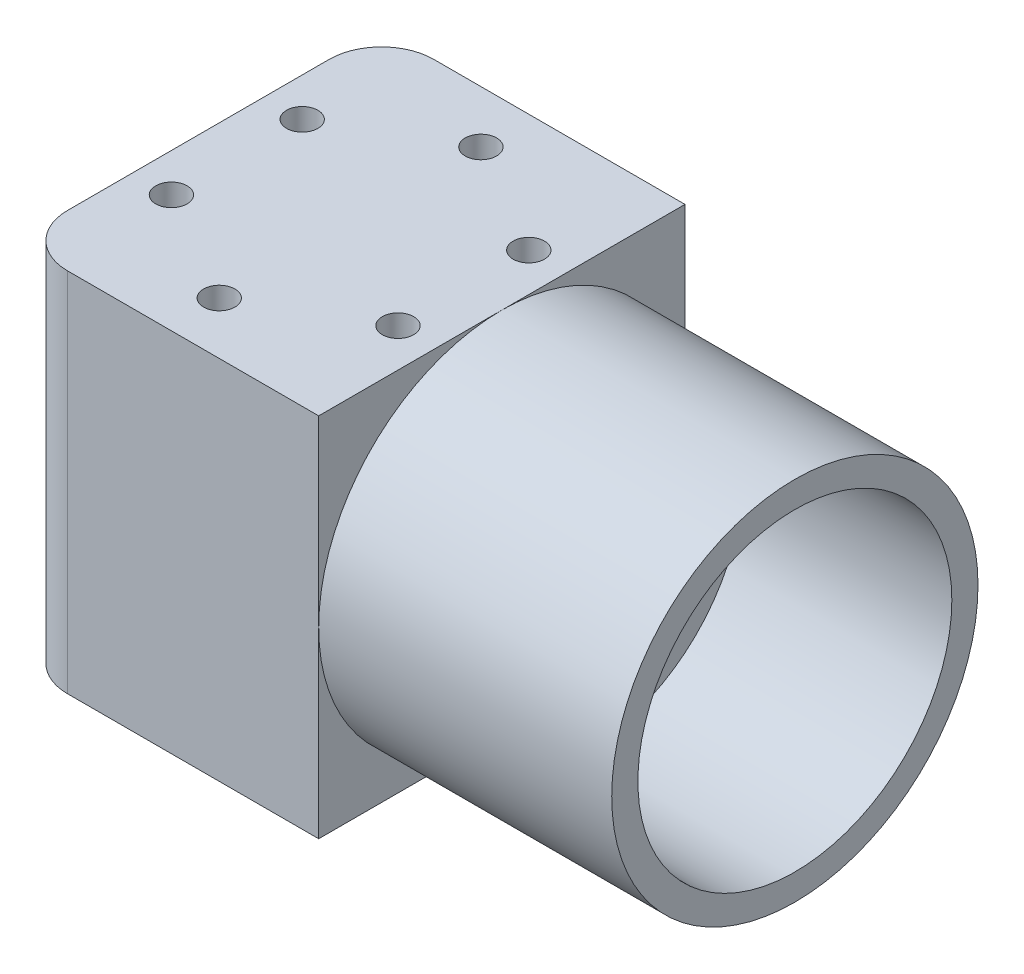
ISO-10303-21;
HEADER;
FILE_DESCRIPTION(('STEP AP214'),'2;1');
FILE_NAME('part.step','',(''),(''),'','','');
FILE_SCHEMA(('AUTOMOTIVE_DESIGN { 1 0 10303 214 1 1 1 1 }'));
ENDSEC;
DATA;
#1=APPLICATION_CONTEXT('core data for automotive mechanical design processes');
#2=APPLICATION_PROTOCOL_DEFINITION('international standard','automotive_design',2000,#1);
#3=PRODUCT_CONTEXT('',#1,'mechanical');
#4=PRODUCT('Part','Part','',(#3));
#5=PRODUCT_RELATED_PRODUCT_CATEGORY('part','',(#4));
#6=PRODUCT_DEFINITION_FORMATION('','',#4);
#7=PRODUCT_DEFINITION_CONTEXT('part definition',#1,'design');
#8=PRODUCT_DEFINITION('design','',#6,#7);
#9=PRODUCT_DEFINITION_SHAPE('','',#8);
#10=(LENGTH_UNIT() NAMED_UNIT(*) SI_UNIT(.MILLI.,.METRE.));
#11=(NAMED_UNIT(*) PLANE_ANGLE_UNIT() SI_UNIT($,.RADIAN.));
#12=(NAMED_UNIT(*) SI_UNIT($,.STERADIAN.) SOLID_ANGLE_UNIT());
#13=UNCERTAINTY_MEASURE_WITH_UNIT(LENGTH_MEASURE(1.E-05),#10,'distance_accuracy_value','');
#14=(GEOMETRIC_REPRESENTATION_CONTEXT(3) GLOBAL_UNCERTAINTY_ASSIGNED_CONTEXT((#13)) GLOBAL_UNIT_ASSIGNED_CONTEXT((#10,
#11,#12)) REPRESENTATION_CONTEXT('',''));
#15=CARTESIAN_POINT('',(0.,0.,0.));
#16=DIRECTION('',(0.,0.,1.));
#17=DIRECTION('',(1.,0.,0.));
#18=AXIS2_PLACEMENT_3D('',#15,#16,#17);
#19=CARTESIAN_POINT('',(14.5,17.5,17.5));
#20=DIRECTION('',(-1.,0.,0.));
#21=DIRECTION('',(0.,0.,1.));
#22=AXIS2_PLACEMENT_3D('',#19,#20,#21);
#23=PLANE('',#22);
#24=CARTESIAN_POINT('',(14.5,0.,0.));
#25=DIRECTION('',(1.,0.,0.));
#26=DIRECTION('',(0.,0.,-1.));
#27=AXIS2_PLACEMENT_3D('',#24,#25,#26);
#28=CIRCLE('',#27,17.5);
#29=CARTESIAN_POINT('',(14.5,0.,-17.5));
#30=VERTEX_POINT('',#29);
#31=CARTESIAN_POINT('',(14.5,17.5,0.));
#32=VERTEX_POINT('',#31);
#33=EDGE_CURVE('E57',#30,#32,#28,.T.);
#34=ORIENTED_EDGE('',*,*,#33,.F.);
#35=DIRECTION('',(0.,-1.,0.));
#36=VECTOR('',#35,1.);
#37=CARTESIAN_POINT('',(14.5,17.5,-17.5));
#38=LINE('',#37,#36);
#39=CARTESIAN_POINT('',(14.5,17.5,-17.5));
#40=VERTEX_POINT('',#39);
#41=EDGE_CURVE('E114',#40,#30,#38,.T.);
#42=ORIENTED_EDGE('',*,*,#41,.F.);
#43=DIRECTION('',(0.,0.,-1.));
#44=VECTOR('',#43,1.);
#45=CARTESIAN_POINT('',(14.5,17.5,17.5));
#46=LINE('',#45,#44);
#47=EDGE_CURVE('E137',#32,#40,#46,.T.);
#48=ORIENTED_EDGE('',*,*,#47,.F.);
#49=EDGE_LOOP('',(#34,#42,#48));
#50=FACE_BOUND('',#49,.T.);
#51=ADVANCED_FACE('F45',(#50),#23,.F.);
#52=CARTESIAN_POINT('',(14.5,0.,17.5));
#53=VERTEX_POINT('',#52);
#54=EDGE_CURVE('E11',#32,#53,#28,.T.);
#55=ORIENTED_EDGE('',*,*,#54,.F.);
#56=CARTESIAN_POINT('',(14.5,17.5,17.5));
#57=VERTEX_POINT('',#56);
#58=EDGE_CURVE('E154',#57,#32,#46,.T.);
#59=ORIENTED_EDGE('',*,*,#58,.F.);
#60=DIRECTION('',(0.,-1.,0.));
#61=VECTOR('',#60,1.);
#62=CARTESIAN_POINT('',(14.5,17.5,17.5));
#63=LINE('',#62,#61);
#64=EDGE_CURVE('E135',#57,#53,#63,.T.);
#65=ORIENTED_EDGE('',*,*,#64,.T.);
#66=EDGE_LOOP('',(#55,#59,#65));
#67=FACE_BOUND('',#66,.T.);
#68=ADVANCED_FACE('F222',(#67),#23,.F.);
#69=CARTESIAN_POINT('',(14.5,-17.5,0.));
#70=VERTEX_POINT('',#69);
#71=EDGE_CURVE('E55',#53,#70,#28,.T.);
#72=ORIENTED_EDGE('',*,*,#71,.F.);
#73=CARTESIAN_POINT('',(14.5,-17.5,17.5));
#74=VERTEX_POINT('',#73);
#75=EDGE_CURVE('E166',#53,#74,#63,.T.);
#76=ORIENTED_EDGE('',*,*,#75,.T.);
#77=DIRECTION('',(0.,0.,-1.));
#78=VECTOR('',#77,1.);
#79=CARTESIAN_POINT('',(14.5,-17.5,17.5));
#80=LINE('',#79,#78);
#81=EDGE_CURVE('E167',#74,#70,#80,.T.);
#82=ORIENTED_EDGE('',*,*,#81,.T.);
#83=EDGE_LOOP('',(#72,#76,#82));
#84=FACE_BOUND('',#83,.T.);
#85=ADVANCED_FACE('F304',(#84),#23,.F.);
#86=EDGE_CURVE('E130',#70,#30,#28,.T.);
#87=ORIENTED_EDGE('',*,*,#86,.F.);
#88=CARTESIAN_POINT('',(14.5,-17.5,-17.5));
#89=VERTEX_POINT('',#88);
#90=EDGE_CURVE('E132',#70,#89,#80,.T.);
#91=ORIENTED_EDGE('',*,*,#90,.T.);
#92=EDGE_CURVE('E118',#30,#89,#38,.T.);
#93=ORIENTED_EDGE('',*,*,#92,.F.);
#94=EDGE_LOOP('',(#87,#91,#93));
#95=FACE_BOUND('',#94,.T.);
#96=ADVANCED_FACE('F128',(#95),#23,.F.);
#97=CARTESIAN_POINT('',(-14.5,17.5,-17.5));
#98=DIRECTION('',(0.,0.,1.));
#99=DIRECTION('',(1.,0.,0.));
#100=AXIS2_PLACEMENT_3D('',#97,#98,#99);
#101=PLANE('',#100);
#102=DIRECTION('',(-1.,0.,0.));
#103=VECTOR('',#102,1.);
#104=CARTESIAN_POINT('',(-14.5,-17.5,-17.5));
#105=LINE('',#104,#103);
#106=CARTESIAN_POINT('',(-9.50000000000001,-17.5,-17.5));
#107=VERTEX_POINT('',#106);
#108=EDGE_CURVE('E170',#89,#107,#105,.T.);
#109=ORIENTED_EDGE('',*,*,#108,.T.);
#110=DIRECTION('',(0.,-1.,0.));
#111=VECTOR('',#110,1.);
#112=CARTESIAN_POINT('',(-9.50000000000001,17.5,-17.5));
#113=LINE('',#112,#111);
#114=CARTESIAN_POINT('',(-9.50000000000001,17.5,-17.5));
#115=VERTEX_POINT('',#114);
#116=EDGE_CURVE('E193',#107,#115,#113,.F.);
#117=ORIENTED_EDGE('',*,*,#116,.T.);
#118=DIRECTION('',(-1.,0.,0.));
#119=VECTOR('',#118,1.);
#120=CARTESIAN_POINT('',(-14.5,17.5,-17.5));
#121=LINE('',#120,#119);
#122=EDGE_CURVE('E121',#40,#115,#121,.T.);
#123=ORIENTED_EDGE('',*,*,#122,.F.);
#124=ORIENTED_EDGE('',*,*,#41,.T.);
#125=ORIENTED_EDGE('',*,*,#92,.T.);
#126=EDGE_LOOP('',(#109,#117,#123,#124,#125));
#127=FACE_BOUND('',#126,.T.);
#128=ADVANCED_FACE('F117',(#127),#101,.F.);
#129=CARTESIAN_POINT('',(-14.5,17.5,17.5));
#130=DIRECTION('',(1.,0.,0.));
#131=DIRECTION('',(0.,0.,-1.));
#132=AXIS2_PLACEMENT_3D('',#129,#130,#131);
#133=PLANE('',#132);
#134=DIRECTION('',(0.,0.,1.));
#135=VECTOR('',#134,1.);
#136=CARTESIAN_POINT('',(-14.5,17.5,17.5));
#137=LINE('',#136,#135);
#138=CARTESIAN_POINT('',(-14.5,17.5,-12.5));
#139=VERTEX_POINT('',#138);
#140=CARTESIAN_POINT('',(-14.5,17.5,12.5));
#141=VERTEX_POINT('',#140);
#142=EDGE_CURVE('E159',#139,#141,#137,.T.);
#143=ORIENTED_EDGE('',*,*,#142,.F.);
#144=DIRECTION('',(0.,-1.,0.));
#145=VECTOR('',#144,1.);
#146=CARTESIAN_POINT('',(-14.5,17.5,-12.5));
#147=LINE('',#146,#145);
#148=CARTESIAN_POINT('',(-14.5,-17.5,-12.5));
#149=VERTEX_POINT('',#148);
#150=EDGE_CURVE('E183',#139,#149,#147,.T.);
#151=ORIENTED_EDGE('',*,*,#150,.T.);
#152=DIRECTION('',(0.,0.,1.));
#153=VECTOR('',#152,1.);
#154=CARTESIAN_POINT('',(-14.5,-17.5,17.5));
#155=LINE('',#154,#153);
#156=CARTESIAN_POINT('',(-14.5,-17.5,12.5));
#157=VERTEX_POINT('',#156);
#158=EDGE_CURVE('E172',#149,#157,#155,.T.);
#159=ORIENTED_EDGE('',*,*,#158,.T.);
#160=DIRECTION('',(0.,-1.,0.));
#161=VECTOR('',#160,1.);
#162=CARTESIAN_POINT('',(-14.5,17.5,12.5));
#163=LINE('',#162,#161);
#164=EDGE_CURVE('E125',#157,#141,#163,.F.);
#165=ORIENTED_EDGE('',*,*,#164,.T.);
#166=EDGE_LOOP('',(#143,#151,#159,#165));
#167=FACE_BOUND('',#166,.T.);
#168=ADVANCED_FACE('F209',(#167),#133,.F.);
#169=CARTESIAN_POINT('',(-14.5,17.5,17.5));
#170=DIRECTION('',(0.,0.,-1.));
#171=DIRECTION('',(-1.,0.,0.));
#172=AXIS2_PLACEMENT_3D('',#169,#170,#171);
#173=PLANE('',#172);
#174=DIRECTION('',(1.,0.,0.));
#175=VECTOR('',#174,1.);
#176=CARTESIAN_POINT('',(-14.5,17.5,17.5));
#177=LINE('',#176,#175);
#178=CARTESIAN_POINT('',(-9.50000000000001,17.5,17.5));
#179=VERTEX_POINT('',#178);
#180=EDGE_CURVE('E163',#179,#57,#177,.T.);
#181=ORIENTED_EDGE('',*,*,#180,.F.);
#182=DIRECTION('',(0.,-1.,0.));
#183=VECTOR('',#182,1.);
#184=CARTESIAN_POINT('',(-9.50000000000001,17.5,17.5));
#185=LINE('',#184,#183);
#186=CARTESIAN_POINT('',(-9.50000000000001,-17.5,17.5));
#187=VERTEX_POINT('',#186);
#188=EDGE_CURVE('E49',#179,#187,#185,.T.);
#189=ORIENTED_EDGE('',*,*,#188,.T.);
#190=DIRECTION('',(1.,0.,0.));
#191=VECTOR('',#190,1.);
#192=CARTESIAN_POINT('',(-14.5,-17.5,17.5));
#193=LINE('',#192,#191);
#194=EDGE_CURVE('E175',#187,#74,#193,.T.);
#195=ORIENTED_EDGE('',*,*,#194,.T.);
#196=ORIENTED_EDGE('',*,*,#75,.F.);
#197=ORIENTED_EDGE('',*,*,#64,.F.);
#198=EDGE_LOOP('',(#181,#189,#195,#196,#197));
#199=FACE_BOUND('',#198,.T.);
#200=ADVANCED_FACE('F221',(#199),#173,.F.);
#201=CARTESIAN_POINT('',(0.,17.5,0.));
#202=DIRECTION('',(0.,-1.,0.));
#203=DIRECTION('',(0.,0.,-1.));
#204=AXIS2_PLACEMENT_3D('',#201,#202,#203);
#205=PLANE('',#204);
#206=CARTESIAN_POINT('',(0.,17.5,12.5));
#207=DIRECTION('',(0.,-1.,0.));
#208=DIRECTION('',(0.,0.,-1.));
#209=AXIS2_PLACEMENT_3D('',#206,#207,#208);
#210=CIRCLE('',#209,1.5);
#211=CARTESIAN_POINT('',(0.,17.5,11.));
#212=VERTEX_POINT('',#211);
#213=EDGE_CURVE('E261',#212,#212,#210,.F.);
#214=ORIENTED_EDGE('',*,*,#213,.F.);
#215=EDGE_LOOP('',(#214));
#216=FACE_BOUND('',#215,.T.);
#217=CARTESIAN_POINT('',(-10.8253175473054,17.5,6.25000000000013));
#218=DIRECTION('',(0.,-1.,0.));
#219=DIRECTION('',(0.,0.,-1.));
#220=AXIS2_PLACEMENT_3D('',#217,#218,#219);
#221=CIRCLE('',#220,1.5);
#222=CARTESIAN_POINT('',(-10.8253175473054,17.5,4.75000000000013));
#223=VERTEX_POINT('',#222);
#224=EDGE_CURVE('E274',#223,#223,#221,.F.);
#225=ORIENTED_EDGE('',*,*,#224,.F.);
#226=EDGE_LOOP('',(#225));
#227=FACE_BOUND('',#226,.T.);
#228=CARTESIAN_POINT('',(-10.8253175473055,17.5,-6.2499999999999));
#229=DIRECTION('',(0.,-1.,0.));
#230=DIRECTION('',(0.,0.,-1.));
#231=AXIS2_PLACEMENT_3D('',#228,#229,#230);
#232=CIRCLE('',#231,1.5);
#233=CARTESIAN_POINT('',(-10.8253175473055,17.5,-7.7499999999999));
#234=VERTEX_POINT('',#233);
#235=EDGE_CURVE('E250',#234,#234,#232,.F.);
#236=ORIENTED_EDGE('',*,*,#235,.F.);
#237=EDGE_LOOP('',(#236));
#238=FACE_BOUND('',#237,.T.);
#239=CARTESIAN_POINT('',(0.,17.5,-12.5));
#240=DIRECTION('',(0.,-1.,0.));
#241=DIRECTION('',(0.,0.,-1.));
#242=AXIS2_PLACEMENT_3D('',#239,#240,#241);
#243=CIRCLE('',#242,1.5);
#244=CARTESIAN_POINT('',(0.,17.5,-14.));
#245=VERTEX_POINT('',#244);
#246=EDGE_CURVE('E232',#245,#245,#243,.F.);
#247=ORIENTED_EDGE('',*,*,#246,.F.);
#248=EDGE_LOOP('',(#247));
#249=FACE_BOUND('',#248,.T.);
#250=CARTESIAN_POINT('',(10.8253175473055,17.5,-6.25000000000005));
#251=DIRECTION('',(0.,-1.,0.));
#252=DIRECTION('',(0.,0.,-1.));
#253=AXIS2_PLACEMENT_3D('',#250,#251,#252);
#254=CIRCLE('',#253,1.5);
#255=CARTESIAN_POINT('',(10.8253175473055,17.5,-7.75000000000005));
#256=VERTEX_POINT('',#255);
#257=EDGE_CURVE('E231',#256,#256,#254,.F.);
#258=ORIENTED_EDGE('',*,*,#257,.F.);
#259=EDGE_LOOP('',(#258));
#260=FACE_BOUND('',#259,.T.);
#261=CARTESIAN_POINT('',(10.8253175473055,17.5,6.24999999999998));
#262=DIRECTION('',(0.,-1.,0.));
#263=DIRECTION('',(0.,0.,-1.));
#264=AXIS2_PLACEMENT_3D('',#261,#262,#263);
#265=CIRCLE('',#264,1.5);
#266=CARTESIAN_POINT('',(10.8253175473055,17.5,4.74999999999998));
#267=VERTEX_POINT('',#266);
#268=EDGE_CURVE('E241',#267,#267,#265,.F.);
#269=ORIENTED_EDGE('',*,*,#268,.F.);
#270=EDGE_LOOP('',(#269));
#271=FACE_BOUND('',#270,.T.);
#272=ORIENTED_EDGE('',*,*,#122,.T.);
#273=CARTESIAN_POINT('',(-9.50000000000001,17.5,-12.5));
#274=DIRECTION('',(0.,-1.,0.));
#275=DIRECTION('',(0.,0.,-1.));
#276=AXIS2_PLACEMENT_3D('',#273,#274,#275);
#277=CIRCLE('',#276,5.);
#278=EDGE_CURVE('E150',#115,#139,#277,.F.);
#279=ORIENTED_EDGE('',*,*,#278,.T.);
#280=ORIENTED_EDGE('',*,*,#142,.T.);
#281=CARTESIAN_POINT('',(-9.50000000000001,17.5,12.5));
#282=DIRECTION('',(0.,-1.,0.));
#283=DIRECTION('',(0.,0.,-1.));
#284=AXIS2_PLACEMENT_3D('',#281,#282,#283);
#285=CIRCLE('',#284,5.);
#286=EDGE_CURVE('E196',#141,#179,#285,.F.);
#287=ORIENTED_EDGE('',*,*,#286,.T.);
#288=ORIENTED_EDGE('',*,*,#180,.T.);
#289=ORIENTED_EDGE('',*,*,#58,.T.);
#290=ORIENTED_EDGE('',*,*,#47,.T.);
#291=EDGE_LOOP('',(#272,#279,#280,#287,#288,#289,#290));
#292=FACE_BOUND('',#291,.T.);
#293=ADVANCED_FACE('F203',(#216,#227,#238,#249,#260,#271,#292),#205,.F.);
#294=CARTESIAN_POINT('',(0.,-17.5,0.));
#295=DIRECTION('',(0.,-1.,0.));
#296=DIRECTION('',(0.,0.,-1.));
#297=AXIS2_PLACEMENT_3D('',#294,#295,#296);
#298=PLANE('',#297);
#299=CARTESIAN_POINT('',(0.,-17.5,12.5));
#300=DIRECTION('',(0.,-1.,0.));
#301=DIRECTION('',(0.,0.,-1.));
#302=AXIS2_PLACEMENT_3D('',#299,#300,#301);
#303=CIRCLE('',#302,1.5);
#304=CARTESIAN_POINT('',(0.,-17.5,11.));
#305=VERTEX_POINT('',#304);
#306=EDGE_CURVE('E266',#305,#305,#303,.T.);
#307=ORIENTED_EDGE('',*,*,#306,.F.);
#308=EDGE_LOOP('',(#307));
#309=FACE_BOUND('',#308,.T.);
#310=CARTESIAN_POINT('',(-10.8253175473054,-17.5,6.25000000000013));
#311=DIRECTION('',(0.,-1.,0.));
#312=DIRECTION('',(0.,0.,-1.));
#313=AXIS2_PLACEMENT_3D('',#310,#311,#312);
#314=CIRCLE('',#313,1.5);
#315=CARTESIAN_POINT('',(-10.8253175473054,-17.5,4.75000000000013));
#316=VERTEX_POINT('',#315);
#317=EDGE_CURVE('E254',#316,#316,#314,.T.);
#318=ORIENTED_EDGE('',*,*,#317,.F.);
#319=EDGE_LOOP('',(#318));
#320=FACE_BOUND('',#319,.T.);
#321=CARTESIAN_POINT('',(-10.8253175473055,-17.5,-6.2499999999999));
#322=DIRECTION('',(0.,-1.,0.));
#323=DIRECTION('',(0.,0.,-1.));
#324=AXIS2_PLACEMENT_3D('',#321,#322,#323);
#325=CIRCLE('',#324,1.5);
#326=CARTESIAN_POINT('',(-10.8253175473055,-17.5,-7.7499999999999));
#327=VERTEX_POINT('',#326);
#328=EDGE_CURVE('E248',#327,#327,#325,.T.);
#329=ORIENTED_EDGE('',*,*,#328,.F.);
#330=EDGE_LOOP('',(#329));
#331=FACE_BOUND('',#330,.T.);
#332=CARTESIAN_POINT('',(0.,-17.5,-12.5));
#333=DIRECTION('',(0.,-1.,0.));
#334=DIRECTION('',(0.,0.,-1.));
#335=AXIS2_PLACEMENT_3D('',#332,#333,#334);
#336=CIRCLE('',#335,1.5);
#337=CARTESIAN_POINT('',(0.,-17.5,-14.));
#338=VERTEX_POINT('',#337);
#339=EDGE_CURVE('E228',#338,#338,#336,.T.);
#340=ORIENTED_EDGE('',*,*,#339,.F.);
#341=EDGE_LOOP('',(#340));
#342=FACE_BOUND('',#341,.T.);
#343=CARTESIAN_POINT('',(10.8253175473055,-17.5,-6.25000000000005));
#344=DIRECTION('',(0.,-1.,0.));
#345=DIRECTION('',(0.,0.,-1.));
#346=AXIS2_PLACEMENT_3D('',#343,#344,#345);
#347=CIRCLE('',#346,1.5);
#348=CARTESIAN_POINT('',(10.8253175473055,-17.5,-7.75000000000005));
#349=VERTEX_POINT('',#348);
#350=EDGE_CURVE('E235',#349,#349,#347,.T.);
#351=ORIENTED_EDGE('',*,*,#350,.F.);
#352=EDGE_LOOP('',(#351));
#353=FACE_BOUND('',#352,.T.);
#354=CARTESIAN_POINT('',(10.8253175473055,-17.5,6.24999999999998));
#355=DIRECTION('',(0.,-1.,0.));
#356=DIRECTION('',(0.,0.,-1.));
#357=AXIS2_PLACEMENT_3D('',#354,#355,#356);
#358=CIRCLE('',#357,1.5);
#359=CARTESIAN_POINT('',(10.8253175473055,-17.5,4.74999999999998));
#360=VERTEX_POINT('',#359);
#361=EDGE_CURVE('E244',#360,#360,#358,.T.);
#362=ORIENTED_EDGE('',*,*,#361,.F.);
#363=EDGE_LOOP('',(#362));
#364=FACE_BOUND('',#363,.T.);
#365=ORIENTED_EDGE('',*,*,#158,.F.);
#366=CARTESIAN_POINT('',(-9.50000000000001,-17.5,-12.5));
#367=DIRECTION('',(0.,-1.,0.));
#368=DIRECTION('',(0.,0.,-1.));
#369=AXIS2_PLACEMENT_3D('',#366,#367,#368);
#370=CIRCLE('',#369,5.);
#371=EDGE_CURVE('E190',#149,#107,#370,.T.);
#372=ORIENTED_EDGE('',*,*,#371,.T.);
#373=ORIENTED_EDGE('',*,*,#108,.F.);
#374=ORIENTED_EDGE('',*,*,#90,.F.);
#375=ORIENTED_EDGE('',*,*,#81,.F.);
#376=ORIENTED_EDGE('',*,*,#194,.F.);
#377=CARTESIAN_POINT('',(-9.50000000000001,-17.5,12.5));
#378=DIRECTION('',(0.,-1.,0.));
#379=DIRECTION('',(0.,0.,-1.));
#380=AXIS2_PLACEMENT_3D('',#377,#378,#379);
#381=CIRCLE('',#380,5.);
#382=EDGE_CURVE('E187',#187,#157,#381,.T.);
#383=ORIENTED_EDGE('',*,*,#382,.T.);
#384=EDGE_LOOP('',(#365,#372,#373,#374,#375,#376,#383));
#385=FACE_BOUND('',#384,.T.);
#386=ADVANCED_FACE('F214',(#309,#320,#331,#342,#353,#364,#385),#298,.T.);
#387=CARTESIAN_POINT('',(-9.50000000000001,17.5,-12.5));
#388=DIRECTION('',(0.,-1.,0.));
#389=DIRECTION('',(0.,0.,-1.));
#390=AXIS2_PLACEMENT_3D('',#387,#388,#389);
#391=CYLINDRICAL_SURFACE('',#390,5.);
#392=ORIENTED_EDGE('',*,*,#278,.F.);
#393=ORIENTED_EDGE('',*,*,#116,.F.);
#394=ORIENTED_EDGE('',*,*,#371,.F.);
#395=ORIENTED_EDGE('',*,*,#150,.F.);
#396=EDGE_LOOP('',(#392,#393,#394,#395));
#397=FACE_BOUND('',#396,.T.);
#398=ADVANCED_FACE('F212',(#397),#391,.T.);
#399=CARTESIAN_POINT('',(-9.50000000000001,17.5,12.5));
#400=DIRECTION('',(0.,-1.,0.));
#401=DIRECTION('',(0.,0.,-1.));
#402=AXIS2_PLACEMENT_3D('',#399,#400,#401);
#403=CYLINDRICAL_SURFACE('',#402,5.);
#404=ORIENTED_EDGE('',*,*,#286,.F.);
#405=ORIENTED_EDGE('',*,*,#164,.F.);
#406=ORIENTED_EDGE('',*,*,#382,.F.);
#407=ORIENTED_EDGE('',*,*,#188,.F.);
#408=EDGE_LOOP('',(#404,#405,#406,#407));
#409=FACE_BOUND('',#408,.T.);
#410=ADVANCED_FACE('F47',(#409),#403,.T.);
#411=CARTESIAN_POINT('',(42.5,0.,0.));
#412=DIRECTION('',(-1.,0.,0.));
#413=DIRECTION('',(0.,0.,1.));
#414=AXIS2_PLACEMENT_3D('',#411,#412,#413);
#415=CYLINDRICAL_SURFACE('',#414,17.5);
#416=CARTESIAN_POINT('',(42.5,0.,0.));
#417=DIRECTION('',(1.,0.,0.));
#418=DIRECTION('',(0.,0.,-1.));
#419=AXIS2_PLACEMENT_3D('',#416,#417,#418);
#420=CIRCLE('',#419,17.5);
#421=CARTESIAN_POINT('',(42.5,0.,-17.5));
#422=VERTEX_POINT('',#421);
#423=EDGE_CURVE('E141',#422,#422,#420,.T.);
#424=ORIENTED_EDGE('',*,*,#423,.F.);
#425=EDGE_LOOP('',(#424));
#426=FACE_BOUND('',#425,.T.);
#427=ORIENTED_EDGE('',*,*,#33,.T.);
#428=ORIENTED_EDGE('',*,*,#54,.T.);
#429=ORIENTED_EDGE('',*,*,#71,.T.);
#430=ORIENTED_EDGE('',*,*,#86,.T.);
#431=EDGE_LOOP('',(#427,#428,#429,#430));
#432=FACE_BOUND('',#431,.T.);
#433=ADVANCED_FACE('F143',(#426,#432),#415,.T.);
#434=CARTESIAN_POINT('',(42.5,0.,0.));
#435=DIRECTION('',(1.,0.,0.));
#436=DIRECTION('',(0.,0.,-1.));
#437=AXIS2_PLACEMENT_3D('',#434,#435,#436);
#438=PLANE('',#437);
#439=CARTESIAN_POINT('',(42.5,0.,0.));
#440=DIRECTION('',(1.,0.,0.));
#441=DIRECTION('',(0.,0.,-1.));
#442=AXIS2_PLACEMENT_3D('',#439,#440,#441);
#443=CIRCLE('',#442,15.);
#444=CARTESIAN_POINT('',(42.5,0.,-15.));
#445=VERTEX_POINT('',#444);
#446=EDGE_CURVE('E226',#445,#445,#443,.T.);
#447=ORIENTED_EDGE('',*,*,#446,.F.);
#448=EDGE_LOOP('',(#447));
#449=FACE_BOUND('',#448,.T.);
#450=ORIENTED_EDGE('',*,*,#423,.T.);
#451=EDGE_LOOP('',(#450));
#452=FACE_BOUND('',#451,.T.);
#453=ADVANCED_FACE('F447',(#449,#452),#438,.T.);
#454=CARTESIAN_POINT('',(22.5,0.,0.));
#455=DIRECTION('',(1.,0.,0.));
#456=DIRECTION('',(0.,0.,-1.));
#457=AXIS2_PLACEMENT_3D('',#454,#455,#456);
#458=CYLINDRICAL_SURFACE('',#457,15.);
#459=CARTESIAN_POINT('',(22.5,0.,0.));
#460=DIRECTION('',(1.,0.,0.));
#461=DIRECTION('',(0.,0.,-1.));
#462=AXIS2_PLACEMENT_3D('',#459,#460,#461);
#463=CIRCLE('',#462,15.);
#464=CARTESIAN_POINT('',(22.5,0.,-15.));
#465=VERTEX_POINT('',#464);
#466=EDGE_CURVE('E142',#465,#465,#463,.T.);
#467=ORIENTED_EDGE('',*,*,#466,.F.);
#468=EDGE_LOOP('',(#467));
#469=FACE_BOUND('',#468,.T.);
#470=ORIENTED_EDGE('',*,*,#446,.T.);
#471=EDGE_LOOP('',(#470));
#472=FACE_BOUND('',#471,.T.);
#473=ADVANCED_FACE('F438',(#469,#472),#458,.F.);
#474=CARTESIAN_POINT('',(22.5,0.,0.));
#475=DIRECTION('',(1.,0.,0.));
#476=DIRECTION('',(0.,0.,-1.));
#477=AXIS2_PLACEMENT_3D('',#474,#475,#476);
#478=PLANE('',#477);
#479=ORIENTED_EDGE('',*,*,#466,.T.);
#480=EDGE_LOOP('',(#479));
#481=FACE_BOUND('',#480,.T.);
#482=ADVANCED_FACE('F362',(#481),#478,.T.);
#483=CARTESIAN_POINT('',(10.8253175473055,17.501,6.24999999999998));
#484=DIRECTION('',(0.,-1.,0.));
#485=DIRECTION('',(0.,0.,-1.));
#486=AXIS2_PLACEMENT_3D('',#483,#484,#485);
#487=CYLINDRICAL_SURFACE('',#486,1.5);
#488=ORIENTED_EDGE('',*,*,#361,.T.);
#489=EDGE_LOOP('',(#488));
#490=FACE_BOUND('',#489,.T.);
#491=ORIENTED_EDGE('',*,*,#268,.T.);
#492=EDGE_LOOP('',(#491));
#493=FACE_BOUND('',#492,.T.);
#494=ADVANCED_FACE('F287',(#490,#493),#487,.F.);
#495=CARTESIAN_POINT('',(10.8253175473055,17.501,-6.25000000000005));
#496=DIRECTION('',(0.,-1.,0.));
#497=DIRECTION('',(0.,0.,-1.));
#498=AXIS2_PLACEMENT_3D('',#495,#496,#497);
#499=CYLINDRICAL_SURFACE('',#498,1.5);
#500=ORIENTED_EDGE('',*,*,#350,.T.);
#501=EDGE_LOOP('',(#500));
#502=FACE_BOUND('',#501,.T.);
#503=ORIENTED_EDGE('',*,*,#257,.T.);
#504=EDGE_LOOP('',(#503));
#505=FACE_BOUND('',#504,.T.);
#506=ADVANCED_FACE('F376',(#502,#505),#499,.F.);
#507=CARTESIAN_POINT('',(0.,17.501,-12.5));
#508=DIRECTION('',(0.,-1.,0.));
#509=DIRECTION('',(0.,0.,-1.));
#510=AXIS2_PLACEMENT_3D('',#507,#508,#509);
#511=CYLINDRICAL_SURFACE('',#510,1.5);
#512=ORIENTED_EDGE('',*,*,#339,.T.);
#513=EDGE_LOOP('',(#512));
#514=FACE_BOUND('',#513,.T.);
#515=ORIENTED_EDGE('',*,*,#246,.T.);
#516=EDGE_LOOP('',(#515));
#517=FACE_BOUND('',#516,.T.);
#518=ADVANCED_FACE('F385',(#514,#517),#511,.F.);
#519=CARTESIAN_POINT('',(-10.8253175473055,17.501,-6.2499999999999));
#520=DIRECTION('',(0.,-1.,0.));
#521=DIRECTION('',(0.,0.,-1.));
#522=AXIS2_PLACEMENT_3D('',#519,#520,#521);
#523=CYLINDRICAL_SURFACE('',#522,1.5);
#524=ORIENTED_EDGE('',*,*,#328,.T.);
#525=EDGE_LOOP('',(#524));
#526=FACE_BOUND('',#525,.T.);
#527=ORIENTED_EDGE('',*,*,#235,.T.);
#528=EDGE_LOOP('',(#527));
#529=FACE_BOUND('',#528,.T.);
#530=ADVANCED_FACE('F395',(#526,#529),#523,.F.);
#531=CARTESIAN_POINT('',(-10.8253175473054,17.501,6.25000000000013));
#532=DIRECTION('',(0.,-1.,0.));
#533=DIRECTION('',(0.,0.,-1.));
#534=AXIS2_PLACEMENT_3D('',#531,#532,#533);
#535=CYLINDRICAL_SURFACE('',#534,1.5);
#536=ORIENTED_EDGE('',*,*,#317,.T.);
#537=EDGE_LOOP('',(#536));
#538=FACE_BOUND('',#537,.T.);
#539=ORIENTED_EDGE('',*,*,#224,.T.);
#540=EDGE_LOOP('',(#539));
#541=FACE_BOUND('',#540,.T.);
#542=ADVANCED_FACE('F405',(#538,#541),#535,.F.);
#543=CARTESIAN_POINT('',(0.,17.501,12.5));
#544=DIRECTION('',(0.,-1.,0.));
#545=DIRECTION('',(0.,0.,-1.));
#546=AXIS2_PLACEMENT_3D('',#543,#544,#545);
#547=CYLINDRICAL_SURFACE('',#546,1.5);
#548=ORIENTED_EDGE('',*,*,#306,.T.);
#549=EDGE_LOOP('',(#548));
#550=FACE_BOUND('',#549,.T.);
#551=ORIENTED_EDGE('',*,*,#213,.T.);
#552=EDGE_LOOP('',(#551));
#553=FACE_BOUND('',#552,.T.);
#554=ADVANCED_FACE('F415',(#550,#553),#547,.F.);
#555=CLOSED_SHELL('',(#51,#68,#85,#96,#128,#168,#200,#293,#386,#398,#410,#433,#453,#473,#482,
#494,#506,#518,#530,#542,#554));
#556=MANIFOLD_SOLID_BREP('B2',#555);
#557=ADVANCED_BREP_SHAPE_REPRESENTATION('',(#18,#556),#14);
#558=SHAPE_DEFINITION_REPRESENTATION(#9,#557);
ENDSEC;
END-ISO-10303-21;
